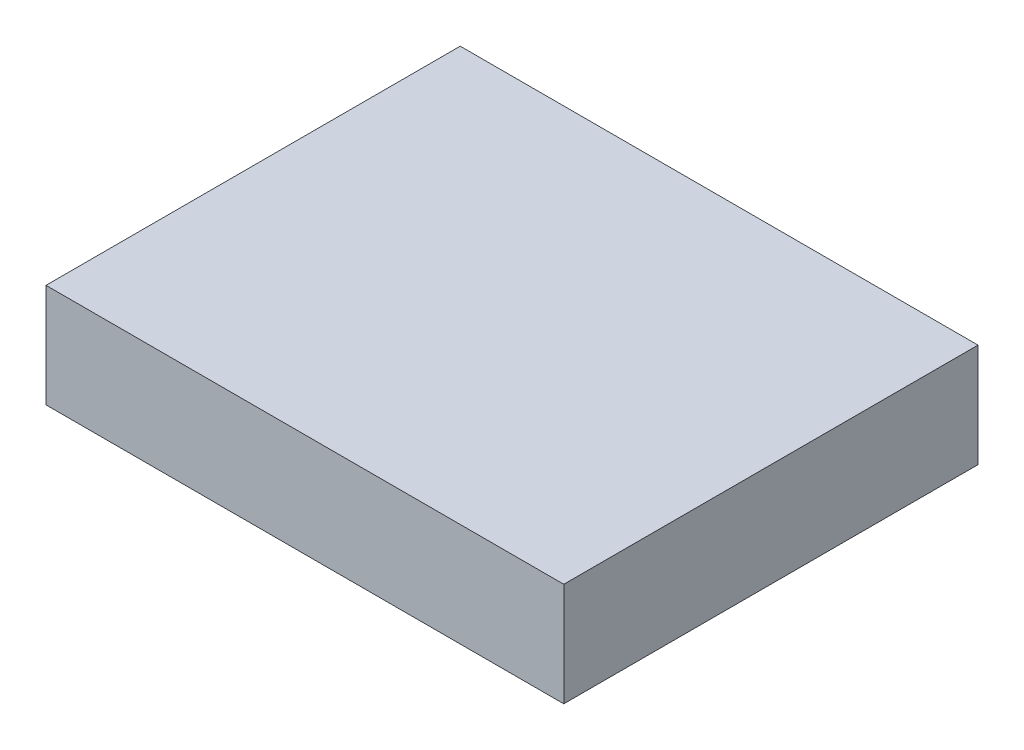
ISO-10303-21;
HEADER;
FILE_DESCRIPTION(('STEP AP214'),'2;1');
FILE_NAME('part.step','',(''),(''),'','','');
FILE_SCHEMA(('AUTOMOTIVE_DESIGN { 1 0 10303 214 1 1 1 1 }'));
ENDSEC;
DATA;
#1=APPLICATION_CONTEXT('core data for automotive mechanical design processes');
#2=APPLICATION_PROTOCOL_DEFINITION('international standard','automotive_design',2000,#1);
#3=PRODUCT_CONTEXT('',#1,'mechanical');
#4=PRODUCT('Part','Part','',(#3));
#5=PRODUCT_RELATED_PRODUCT_CATEGORY('part','',(#4));
#6=PRODUCT_DEFINITION_FORMATION('','',#4);
#7=PRODUCT_DEFINITION_CONTEXT('part definition',#1,'design');
#8=PRODUCT_DEFINITION('design','',#6,#7);
#9=PRODUCT_DEFINITION_SHAPE('','',#8);
#10=(LENGTH_UNIT() NAMED_UNIT(*) SI_UNIT(.MILLI.,.METRE.));
#11=(NAMED_UNIT(*) PLANE_ANGLE_UNIT() SI_UNIT($,.RADIAN.));
#12=(NAMED_UNIT(*) SI_UNIT($,.STERADIAN.) SOLID_ANGLE_UNIT());
#13=UNCERTAINTY_MEASURE_WITH_UNIT(LENGTH_MEASURE(1.E-05),#10,'distance_accuracy_value','');
#14=(GEOMETRIC_REPRESENTATION_CONTEXT(3) GLOBAL_UNCERTAINTY_ASSIGNED_CONTEXT((#13)) GLOBAL_UNIT_ASSIGNED_CONTEXT((#10,
#11,#12)) REPRESENTATION_CONTEXT('',''));
#15=CARTESIAN_POINT('',(0.,0.,0.));
#16=DIRECTION('',(0.,0.,1.));
#17=DIRECTION('',(1.,0.,0.));
#18=AXIS2_PLACEMENT_3D('',#15,#16,#17);
#19=CARTESIAN_POINT('',(0.,3.,0.));
#20=DIRECTION('',(-1.,0.,0.));
#21=DIRECTION('',(0.,0.,1.));
#22=AXIS2_PLACEMENT_3D('',#19,#20,#21);
#23=PLANE('',#22);
#24=DIRECTION('',(0.,0.,-1.));
#25=VECTOR('',#24,1.);
#26=CARTESIAN_POINT('',(0.,0.,0.));
#27=LINE('',#26,#25);
#28=CARTESIAN_POINT('',(0.,0.,12.));
#29=VERTEX_POINT('',#28);
#30=CARTESIAN_POINT('',(0.,0.,0.));
#31=VERTEX_POINT('',#30);
#32=EDGE_CURVE('E113',#29,#31,#27,.T.);
#33=ORIENTED_EDGE('',*,*,#32,.T.);
#34=DIRECTION('',(0.,-1.,0.));
#35=VECTOR('',#34,1.);
#36=CARTESIAN_POINT('',(0.,3.,0.));
#37=LINE('',#36,#35);
#38=CARTESIAN_POINT('',(0.,3.,0.));
#39=VERTEX_POINT('',#38);
#40=EDGE_CURVE('E11',#39,#31,#37,.T.);
#41=ORIENTED_EDGE('',*,*,#40,.F.);
#42=DIRECTION('',(0.,0.,-1.));
#43=VECTOR('',#42,1.);
#44=CARTESIAN_POINT('',(0.,3.,0.));
#45=LINE('',#44,#43);
#46=CARTESIAN_POINT('',(0.,3.,12.));
#47=VERTEX_POINT('',#46);
#48=EDGE_CURVE('E97',#47,#39,#45,.T.);
#49=ORIENTED_EDGE('',*,*,#48,.F.);
#50=DIRECTION('',(0.,-1.,0.));
#51=VECTOR('',#50,1.);
#52=CARTESIAN_POINT('',(0.,3.,12.));
#53=LINE('',#52,#51);
#54=EDGE_CURVE('E109',#47,#29,#53,.T.);
#55=ORIENTED_EDGE('',*,*,#54,.T.);
#56=EDGE_LOOP('',(#33,#41,#49,#55));
#57=FACE_BOUND('',#56,.T.);
#58=ADVANCED_FACE('F45',(#57),#23,.F.);
#59=CARTESIAN_POINT('',(0.,3.,0.));
#60=DIRECTION('',(0.,0.,1.));
#61=DIRECTION('',(1.,0.,0.));
#62=AXIS2_PLACEMENT_3D('',#59,#60,#61);
#63=PLANE('',#62);
#64=DIRECTION('',(-1.,0.,0.));
#65=VECTOR('',#64,1.);
#66=CARTESIAN_POINT('',(0.,0.,0.));
#67=LINE('',#66,#65);
#68=CARTESIAN_POINT('',(-15.,0.,0.));
#69=VERTEX_POINT('',#68);
#70=EDGE_CURVE('E102',#31,#69,#67,.T.);
#71=ORIENTED_EDGE('',*,*,#70,.T.);
#72=DIRECTION('',(0.,-1.,0.));
#73=VECTOR('',#72,1.);
#74=CARTESIAN_POINT('',(-15.,3.,0.));
#75=LINE('',#74,#73);
#76=CARTESIAN_POINT('',(-15.,3.,0.));
#77=VERTEX_POINT('',#76);
#78=EDGE_CURVE('E54',#77,#69,#75,.T.);
#79=ORIENTED_EDGE('',*,*,#78,.F.);
#80=DIRECTION('',(-1.,0.,0.));
#81=VECTOR('',#80,1.);
#82=CARTESIAN_POINT('',(0.,3.,0.));
#83=LINE('',#82,#81);
#84=EDGE_CURVE('E92',#39,#77,#83,.T.);
#85=ORIENTED_EDGE('',*,*,#84,.F.);
#86=ORIENTED_EDGE('',*,*,#40,.T.);
#87=EDGE_LOOP('',(#71,#79,#85,#86));
#88=FACE_BOUND('',#87,.T.);
#89=ADVANCED_FACE('F101',(#88),#63,.F.);
#90=CARTESIAN_POINT('',(-15.,3.,0.));
#91=DIRECTION('',(1.,0.,0.));
#92=DIRECTION('',(0.,0.,-1.));
#93=AXIS2_PLACEMENT_3D('',#90,#91,#92);
#94=PLANE('',#93);
#95=DIRECTION('',(0.,0.,1.));
#96=VECTOR('',#95,1.);
#97=CARTESIAN_POINT('',(-15.,0.,0.));
#98=LINE('',#97,#96);
#99=CARTESIAN_POINT('',(-15.,0.,12.));
#100=VERTEX_POINT('',#99);
#101=EDGE_CURVE('E79',#69,#100,#98,.T.);
#102=ORIENTED_EDGE('',*,*,#101,.T.);
#103=DIRECTION('',(0.,-1.,0.));
#104=VECTOR('',#103,1.);
#105=CARTESIAN_POINT('',(-15.,3.,12.));
#106=LINE('',#105,#104);
#107=CARTESIAN_POINT('',(-15.,3.,12.));
#108=VERTEX_POINT('',#107);
#109=EDGE_CURVE('E104',#108,#100,#106,.T.);
#110=ORIENTED_EDGE('',*,*,#109,.F.);
#111=DIRECTION('',(0.,0.,1.));
#112=VECTOR('',#111,1.);
#113=CARTESIAN_POINT('',(-15.,3.,0.));
#114=LINE('',#113,#112);
#115=EDGE_CURVE('E95',#77,#108,#114,.T.);
#116=ORIENTED_EDGE('',*,*,#115,.F.);
#117=ORIENTED_EDGE('',*,*,#78,.T.);
#118=EDGE_LOOP('',(#102,#110,#116,#117));
#119=FACE_BOUND('',#118,.T.);
#120=ADVANCED_FACE('F105',(#119),#94,.F.);
#121=CARTESIAN_POINT('',(0.,3.,12.));
#122=DIRECTION('',(0.,0.,-1.));
#123=DIRECTION('',(-1.,0.,0.));
#124=AXIS2_PLACEMENT_3D('',#121,#122,#123);
#125=PLANE('',#124);
#126=DIRECTION('',(1.,0.,0.));
#127=VECTOR('',#126,1.);
#128=CARTESIAN_POINT('',(0.,0.,12.));
#129=LINE('',#128,#127);
#130=EDGE_CURVE('E85',#100,#29,#129,.T.);
#131=ORIENTED_EDGE('',*,*,#130,.T.);
#132=ORIENTED_EDGE('',*,*,#54,.F.);
#133=DIRECTION('',(1.,0.,0.));
#134=VECTOR('',#133,1.);
#135=CARTESIAN_POINT('',(0.,3.,12.));
#136=LINE('',#135,#134);
#137=EDGE_CURVE('E62',#108,#47,#136,.T.);
#138=ORIENTED_EDGE('',*,*,#137,.F.);
#139=ORIENTED_EDGE('',*,*,#109,.T.);
#140=EDGE_LOOP('',(#131,#132,#138,#139));
#141=FACE_BOUND('',#140,.T.);
#142=ADVANCED_FACE('F126',(#141),#125,.F.);
#143=CARTESIAN_POINT('',(0.,3.,0.));
#144=DIRECTION('',(0.,-1.,0.));
#145=DIRECTION('',(0.,0.,-1.));
#146=AXIS2_PLACEMENT_3D('',#143,#144,#145);
#147=PLANE('',#146);
#148=ORIENTED_EDGE('',*,*,#48,.T.);
#149=ORIENTED_EDGE('',*,*,#84,.T.);
#150=ORIENTED_EDGE('',*,*,#115,.T.);
#151=ORIENTED_EDGE('',*,*,#137,.T.);
#152=EDGE_LOOP('',(#148,#149,#150,#151));
#153=FACE_BOUND('',#152,.T.);
#154=ADVANCED_FACE('F93',(#153),#147,.F.);
#155=CARTESIAN_POINT('',(0.,0.,0.));
#156=DIRECTION('',(0.,-1.,0.));
#157=DIRECTION('',(0.,0.,-1.));
#158=AXIS2_PLACEMENT_3D('',#155,#156,#157);
#159=PLANE('',#158);
#160=ORIENTED_EDGE('',*,*,#32,.F.);
#161=ORIENTED_EDGE('',*,*,#130,.F.);
#162=ORIENTED_EDGE('',*,*,#101,.F.);
#163=ORIENTED_EDGE('',*,*,#70,.F.);
#164=EDGE_LOOP('',(#160,#161,#162,#163));
#165=FACE_BOUND('',#164,.T.);
#166=ADVANCED_FACE('F129',(#165),#159,.T.);
#167=CLOSED_SHELL('',(#58,#89,#120,#142,#154,#166));
#168=MANIFOLD_SOLID_BREP('B2',#167);
#169=ADVANCED_BREP_SHAPE_REPRESENTATION('',(#18,#168),#14);
#170=SHAPE_DEFINITION_REPRESENTATION(#9,#169);
ENDSEC;
END-ISO-10303-21;
